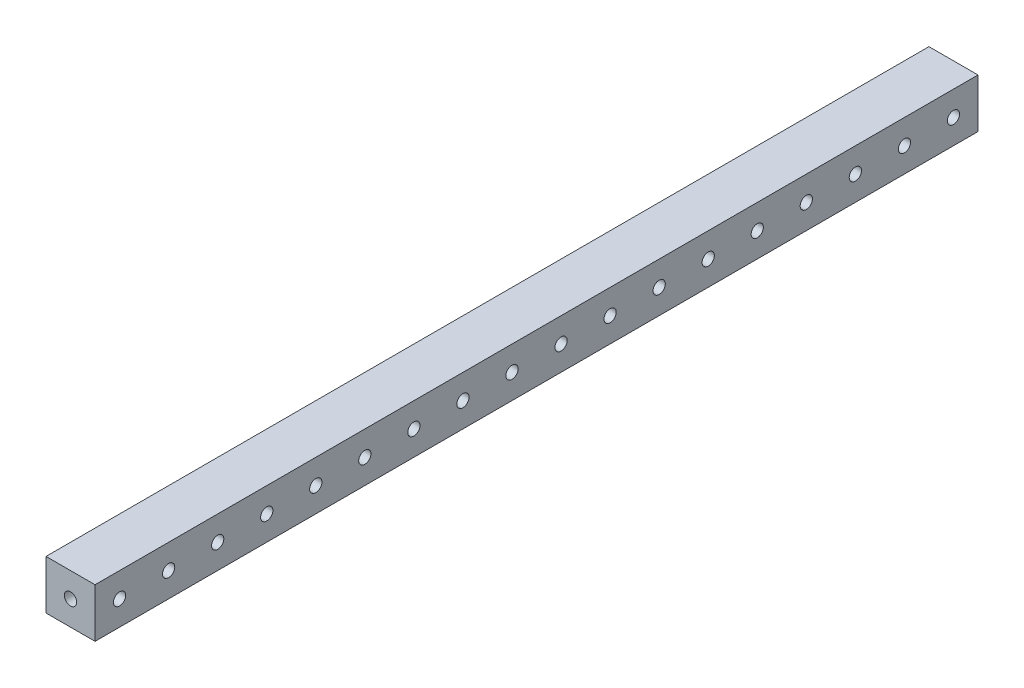
ISO-10303-21;
HEADER;
FILE_DESCRIPTION(('STEP AP214'),'2;1');
FILE_NAME('part.step','',(''),(''),'','','');
FILE_SCHEMA(('AUTOMOTIVE_DESIGN { 1 0 10303 214 1 1 1 1 }'));
ENDSEC;
DATA;
#1=APPLICATION_CONTEXT('core data for automotive mechanical design processes');
#2=APPLICATION_PROTOCOL_DEFINITION('international standard','automotive_design',2000,#1);
#3=PRODUCT_CONTEXT('',#1,'mechanical');
#4=PRODUCT('Part','Part','',(#3));
#5=PRODUCT_RELATED_PRODUCT_CATEGORY('part','',(#4));
#6=PRODUCT_DEFINITION_FORMATION('','',#4);
#7=PRODUCT_DEFINITION_CONTEXT('part definition',#1,'design');
#8=PRODUCT_DEFINITION('design','',#6,#7);
#9=PRODUCT_DEFINITION_SHAPE('','',#8);
#10=(LENGTH_UNIT() NAMED_UNIT(*) SI_UNIT(.MILLI.,.METRE.));
#11=(NAMED_UNIT(*) PLANE_ANGLE_UNIT() SI_UNIT($,.RADIAN.));
#12=(NAMED_UNIT(*) SI_UNIT($,.STERADIAN.) SOLID_ANGLE_UNIT());
#13=UNCERTAINTY_MEASURE_WITH_UNIT(LENGTH_MEASURE(1.E-05),#10,'distance_accuracy_value','');
#14=(GEOMETRIC_REPRESENTATION_CONTEXT(3) GLOBAL_UNCERTAINTY_ASSIGNED_CONTEXT((#13)) GLOBAL_UNIT_ASSIGNED_CONTEXT((#10,
#11,#12)) REPRESENTATION_CONTEXT('',''));
#15=CARTESIAN_POINT('',(0.,0.,0.));
#16=DIRECTION('',(0.,0.,1.));
#17=DIRECTION('',(1.,0.,0.));
#18=AXIS2_PLACEMENT_3D('',#15,#16,#17);
#19=CARTESIAN_POINT('',(10.,0.,-170.));
#20=DIRECTION('',(1.,0.,0.));
#21=DIRECTION('',(0.,0.,-1.));
#22=AXIS2_PLACEMENT_3D('',#19,#20,#21);
#23=CYLINDRICAL_SURFACE('',#22,2.5);
#24=CARTESIAN_POINT('',(10.,0.,-170.));
#25=DIRECTION('',(1.,0.,0.));
#26=DIRECTION('',(0.,0.,-1.));
#27=AXIS2_PLACEMENT_3D('',#24,#25,#26);
#28=CIRCLE('',#27,2.5);
#29=CARTESIAN_POINT('',(10.,0.,-172.5));
#30=VERTEX_POINT('',#29);
#31=EDGE_CURVE('E117',#30,#30,#28,.T.);
#32=ORIENTED_EDGE('',*,*,#31,.T.);
#33=EDGE_LOOP('',(#32));
#34=FACE_BOUND('',#33,.T.);
#35=CARTESIAN_POINT('',(0.,0.,-170.));
#36=DIRECTION('',(0.707106781186547,0.,0.707106781186547));
#37=DIRECTION('',(0.707106781186547,0.,-0.707106781186547));
#38=AXIS2_PLACEMENT_3D('',#35,#36,#37);
#39=ELLIPSE('',#38,3.53553390593271,2.49999999999998);
#40=CARTESIAN_POINT('',(0.,2.49999999999998,-170.));
#41=VERTEX_POINT('',#40);
#42=CARTESIAN_POINT('',(0.,-2.49999999999998,-170.));
#43=VERTEX_POINT('',#42);
#44=EDGE_CURVE('E46',#41,#43,#39,.F.);
#45=ORIENTED_EDGE('',*,*,#44,.T.);
#46=CARTESIAN_POINT('',(0.,0.,-170.));
#47=DIRECTION('',(0.707106781186547,0.,-0.707106781186547));
#48=DIRECTION('',(0.707106781186547,0.,0.707106781186547));
#49=AXIS2_PLACEMENT_3D('',#46,#47,#48);
#50=ELLIPSE('',#49,3.53553390593271,2.49999999999998);
#51=EDGE_CURVE('E11',#43,#41,#50,.F.);
#52=ORIENTED_EDGE('',*,*,#51,.T.);
#53=EDGE_LOOP('',(#45,#52));
#54=FACE_BOUND('',#53,.T.);
#55=ADVANCED_FACE('F33',(#34,#54),#23,.F.);
#56=CARTESIAN_POINT('',(10.,0.,170.));
#57=DIRECTION('',(1.,0.,0.));
#58=DIRECTION('',(0.,0.,-1.));
#59=AXIS2_PLACEMENT_3D('',#56,#57,#58);
#60=CYLINDRICAL_SURFACE('',#59,2.5);
#61=CARTESIAN_POINT('',(10.,0.,170.));
#62=DIRECTION('',(1.,0.,0.));
#63=DIRECTION('',(0.,0.,-1.));
#64=AXIS2_PLACEMENT_3D('',#61,#62,#63);
#65=CIRCLE('',#64,2.5);
#66=CARTESIAN_POINT('',(10.,0.,167.5));
#67=VERTEX_POINT('',#66);
#68=EDGE_CURVE('E246',#67,#67,#65,.T.);
#69=ORIENTED_EDGE('',*,*,#68,.T.);
#70=EDGE_LOOP('',(#69));
#71=FACE_BOUND('',#70,.T.);
#72=CARTESIAN_POINT('',(0.,0.,170.));
#73=DIRECTION('',(0.707106781186547,0.,-0.707106781186547));
#74=DIRECTION('',(0.707106781186547,0.,0.707106781186547));
#75=AXIS2_PLACEMENT_3D('',#72,#73,#74);
#76=ELLIPSE('',#75,3.53553390593271,2.49999999999998);
#77=CARTESIAN_POINT('',(0.,-2.49999999999998,170.));
#78=VERTEX_POINT('',#77);
#79=CARTESIAN_POINT('',(0.,2.49999999999998,170.));
#80=VERTEX_POINT('',#79);
#81=EDGE_CURVE('E53',#78,#80,#76,.F.);
#82=ORIENTED_EDGE('',*,*,#81,.T.);
#83=CARTESIAN_POINT('',(0.,0.,170.));
#84=DIRECTION('',(0.707106781186547,0.,0.707106781186547));
#85=DIRECTION('',(0.707106781186547,0.,-0.707106781186547));
#86=AXIS2_PLACEMENT_3D('',#83,#84,#85);
#87=ELLIPSE('',#86,3.53553390593271,2.49999999999998);
#88=EDGE_CURVE('E256',#80,#78,#87,.F.);
#89=ORIENTED_EDGE('',*,*,#88,.T.);
#90=EDGE_LOOP('',(#82,#89));
#91=FACE_BOUND('',#90,.T.);
#92=ADVANCED_FACE('F270',(#71,#91),#60,.F.);
#93=CARTESIAN_POINT('',(0.,0.,170.));
#94=DIRECTION('',(0.707106781186547,0.,-0.707106781186547));
#95=DIRECTION('',(0.707106781186547,0.,0.707106781186547));
#96=AXIS2_PLACEMENT_3D('',#93,#94,#95);
#97=ELLIPSE('',#96,3.53553390593271,2.49999999999998);
#98=EDGE_CURVE('E250',#78,#80,#97,.T.);
#99=ORIENTED_EDGE('',*,*,#98,.T.);
#100=CARTESIAN_POINT('',(0.,0.,170.));
#101=DIRECTION('',(0.707106781186547,0.,0.707106781186547));
#102=DIRECTION('',(0.707106781186547,0.,-0.707106781186547));
#103=AXIS2_PLACEMENT_3D('',#100,#101,#102);
#104=ELLIPSE('',#103,3.53553390593271,2.49999999999998);
#105=EDGE_CURVE('E253',#80,#78,#104,.T.);
#106=ORIENTED_EDGE('',*,*,#105,.T.);
#107=EDGE_LOOP('',(#99,#106));
#108=FACE_BOUND('',#107,.T.);
#109=CARTESIAN_POINT('',(-10.,0.,170.));
#110=DIRECTION('',(1.,0.,0.));
#111=DIRECTION('',(0.,0.,-1.));
#112=AXIS2_PLACEMENT_3D('',#109,#110,#111);
#113=CIRCLE('',#112,2.5);
#114=CARTESIAN_POINT('',(-10.,0.,167.5));
#115=VERTEX_POINT('',#114);
#116=EDGE_CURVE('E243',#115,#115,#113,.T.);
#117=ORIENTED_EDGE('',*,*,#116,.F.);
#118=EDGE_LOOP('',(#117));
#119=FACE_BOUND('',#118,.T.);
#120=ADVANCED_FACE('F35',(#108,#119),#60,.F.);
#121=CARTESIAN_POINT('',(10.,0.,150.));
#122=DIRECTION('',(1.,0.,0.));
#123=DIRECTION('',(0.,0.,-1.));
#124=AXIS2_PLACEMENT_3D('',#121,#122,#123);
#125=CYLINDRICAL_SURFACE('',#124,2.5);
#126=CARTESIAN_POINT('',(-10.,0.,150.));
#127=DIRECTION('',(1.,0.,0.));
#128=DIRECTION('',(0.,0.,-1.));
#129=AXIS2_PLACEMENT_3D('',#126,#127,#128);
#130=CIRCLE('',#129,2.5);
#131=CARTESIAN_POINT('',(-10.,0.,147.5));
#132=VERTEX_POINT('',#131);
#133=EDGE_CURVE('E237',#132,#132,#130,.T.);
#134=ORIENTED_EDGE('',*,*,#133,.F.);
#135=EDGE_LOOP('',(#134));
#136=FACE_BOUND('',#135,.T.);
#137=CARTESIAN_POINT('',(10.,0.,150.));
#138=DIRECTION('',(1.,0.,0.));
#139=DIRECTION('',(0.,0.,-1.));
#140=AXIS2_PLACEMENT_3D('',#137,#138,#139);
#141=CIRCLE('',#140,2.5);
#142=CARTESIAN_POINT('',(10.,0.,147.5));
#143=VERTEX_POINT('',#142);
#144=EDGE_CURVE('E240',#143,#143,#141,.T.);
#145=ORIENTED_EDGE('',*,*,#144,.T.);
#146=EDGE_LOOP('',(#145));
#147=FACE_BOUND('',#146,.T.);
#148=ADVANCED_FACE('F368',(#136,#147),#125,.F.);
#149=CARTESIAN_POINT('',(10.,0.,130.));
#150=DIRECTION('',(1.,0.,0.));
#151=DIRECTION('',(0.,0.,-1.));
#152=AXIS2_PLACEMENT_3D('',#149,#150,#151);
#153=CYLINDRICAL_SURFACE('',#152,2.5);
#154=CARTESIAN_POINT('',(-10.,0.,130.));
#155=DIRECTION('',(1.,0.,0.));
#156=DIRECTION('',(0.,0.,-1.));
#157=AXIS2_PLACEMENT_3D('',#154,#155,#156);
#158=CIRCLE('',#157,2.5);
#159=CARTESIAN_POINT('',(-10.,0.,127.5));
#160=VERTEX_POINT('',#159);
#161=EDGE_CURVE('E231',#160,#160,#158,.T.);
#162=ORIENTED_EDGE('',*,*,#161,.F.);
#163=EDGE_LOOP('',(#162));
#164=FACE_BOUND('',#163,.T.);
#165=CARTESIAN_POINT('',(10.,0.,130.));
#166=DIRECTION('',(1.,0.,0.));
#167=DIRECTION('',(0.,0.,-1.));
#168=AXIS2_PLACEMENT_3D('',#165,#166,#167);
#169=CIRCLE('',#168,2.5);
#170=CARTESIAN_POINT('',(10.,0.,127.5));
#171=VERTEX_POINT('',#170);
#172=EDGE_CURVE('E234',#171,#171,#169,.T.);
#173=ORIENTED_EDGE('',*,*,#172,.T.);
#174=EDGE_LOOP('',(#173));
#175=FACE_BOUND('',#174,.T.);
#176=ADVANCED_FACE('F365',(#164,#175),#153,.F.);
#177=CARTESIAN_POINT('',(10.,0.,110.));
#178=DIRECTION('',(1.,0.,0.));
#179=DIRECTION('',(0.,0.,-1.));
#180=AXIS2_PLACEMENT_3D('',#177,#178,#179);
#181=CYLINDRICAL_SURFACE('',#180,2.5);
#182=CARTESIAN_POINT('',(-10.,0.,110.));
#183=DIRECTION('',(1.,0.,0.));
#184=DIRECTION('',(0.,0.,-1.));
#185=AXIS2_PLACEMENT_3D('',#182,#183,#184);
#186=CIRCLE('',#185,2.5);
#187=CARTESIAN_POINT('',(-10.,0.,107.5));
#188=VERTEX_POINT('',#187);
#189=EDGE_CURVE('E225',#188,#188,#186,.T.);
#190=ORIENTED_EDGE('',*,*,#189,.F.);
#191=EDGE_LOOP('',(#190));
#192=FACE_BOUND('',#191,.T.);
#193=CARTESIAN_POINT('',(10.,0.,110.));
#194=DIRECTION('',(1.,0.,0.));
#195=DIRECTION('',(0.,0.,-1.));
#196=AXIS2_PLACEMENT_3D('',#193,#194,#195);
#197=CIRCLE('',#196,2.5);
#198=CARTESIAN_POINT('',(10.,0.,107.5));
#199=VERTEX_POINT('',#198);
#200=EDGE_CURVE('E228',#199,#199,#197,.T.);
#201=ORIENTED_EDGE('',*,*,#200,.T.);
#202=EDGE_LOOP('',(#201));
#203=FACE_BOUND('',#202,.T.);
#204=ADVANCED_FACE('F361',(#192,#203),#181,.F.);
#205=CARTESIAN_POINT('',(10.,0.,90.));
#206=DIRECTION('',(1.,0.,0.));
#207=DIRECTION('',(0.,0.,-1.));
#208=AXIS2_PLACEMENT_3D('',#205,#206,#207);
#209=CYLINDRICAL_SURFACE('',#208,2.5);
#210=CARTESIAN_POINT('',(-10.,0.,90.));
#211=DIRECTION('',(1.,0.,0.));
#212=DIRECTION('',(0.,0.,-1.));
#213=AXIS2_PLACEMENT_3D('',#210,#211,#212);
#214=CIRCLE('',#213,2.5);
#215=CARTESIAN_POINT('',(-10.,0.,87.5));
#216=VERTEX_POINT('',#215);
#217=EDGE_CURVE('E219',#216,#216,#214,.T.);
#218=ORIENTED_EDGE('',*,*,#217,.F.);
#219=EDGE_LOOP('',(#218));
#220=FACE_BOUND('',#219,.T.);
#221=CARTESIAN_POINT('',(10.,0.,90.));
#222=DIRECTION('',(1.,0.,0.));
#223=DIRECTION('',(0.,0.,-1.));
#224=AXIS2_PLACEMENT_3D('',#221,#222,#223);
#225=CIRCLE('',#224,2.5);
#226=CARTESIAN_POINT('',(10.,0.,87.5));
#227=VERTEX_POINT('',#226);
#228=EDGE_CURVE('E222',#227,#227,#225,.T.);
#229=ORIENTED_EDGE('',*,*,#228,.T.);
#230=EDGE_LOOP('',(#229));
#231=FACE_BOUND('',#230,.T.);
#232=ADVANCED_FACE('F357',(#220,#231),#209,.F.);
#233=CARTESIAN_POINT('',(10.,0.,70.));
#234=DIRECTION('',(1.,0.,0.));
#235=DIRECTION('',(0.,0.,-1.));
#236=AXIS2_PLACEMENT_3D('',#233,#234,#235);
#237=CYLINDRICAL_SURFACE('',#236,2.5);
#238=CARTESIAN_POINT('',(-10.,0.,70.));
#239=DIRECTION('',(1.,0.,0.));
#240=DIRECTION('',(0.,0.,-1.));
#241=AXIS2_PLACEMENT_3D('',#238,#239,#240);
#242=CIRCLE('',#241,2.5);
#243=CARTESIAN_POINT('',(-10.,0.,67.5));
#244=VERTEX_POINT('',#243);
#245=EDGE_CURVE('E213',#244,#244,#242,.T.);
#246=ORIENTED_EDGE('',*,*,#245,.F.);
#247=EDGE_LOOP('',(#246));
#248=FACE_BOUND('',#247,.T.);
#249=CARTESIAN_POINT('',(10.,0.,70.));
#250=DIRECTION('',(1.,0.,0.));
#251=DIRECTION('',(0.,0.,-1.));
#252=AXIS2_PLACEMENT_3D('',#249,#250,#251);
#253=CIRCLE('',#252,2.5);
#254=CARTESIAN_POINT('',(10.,0.,67.5));
#255=VERTEX_POINT('',#254);
#256=EDGE_CURVE('E216',#255,#255,#253,.T.);
#257=ORIENTED_EDGE('',*,*,#256,.T.);
#258=EDGE_LOOP('',(#257));
#259=FACE_BOUND('',#258,.T.);
#260=ADVANCED_FACE('F353',(#248,#259),#237,.F.);
#261=CARTESIAN_POINT('',(10.,0.,50.));
#262=DIRECTION('',(1.,0.,0.));
#263=DIRECTION('',(0.,0.,-1.));
#264=AXIS2_PLACEMENT_3D('',#261,#262,#263);
#265=CYLINDRICAL_SURFACE('',#264,2.5);
#266=CARTESIAN_POINT('',(-10.,0.,50.));
#267=DIRECTION('',(1.,0.,0.));
#268=DIRECTION('',(0.,0.,-1.));
#269=AXIS2_PLACEMENT_3D('',#266,#267,#268);
#270=CIRCLE('',#269,2.5);
#271=CARTESIAN_POINT('',(-10.,0.,47.5));
#272=VERTEX_POINT('',#271);
#273=EDGE_CURVE('E207',#272,#272,#270,.T.);
#274=ORIENTED_EDGE('',*,*,#273,.F.);
#275=EDGE_LOOP('',(#274));
#276=FACE_BOUND('',#275,.T.);
#277=CARTESIAN_POINT('',(10.,0.,50.));
#278=DIRECTION('',(1.,0.,0.));
#279=DIRECTION('',(0.,0.,-1.));
#280=AXIS2_PLACEMENT_3D('',#277,#278,#279);
#281=CIRCLE('',#280,2.5);
#282=CARTESIAN_POINT('',(10.,0.,47.5));
#283=VERTEX_POINT('',#282);
#284=EDGE_CURVE('E210',#283,#283,#281,.T.);
#285=ORIENTED_EDGE('',*,*,#284,.T.);
#286=EDGE_LOOP('',(#285));
#287=FACE_BOUND('',#286,.T.);
#288=ADVANCED_FACE('F349',(#276,#287),#265,.F.);
#289=CARTESIAN_POINT('',(10.,0.,30.));
#290=DIRECTION('',(1.,0.,0.));
#291=DIRECTION('',(0.,0.,-1.));
#292=AXIS2_PLACEMENT_3D('',#289,#290,#291);
#293=CYLINDRICAL_SURFACE('',#292,2.5);
#294=CARTESIAN_POINT('',(-10.,0.,30.));
#295=DIRECTION('',(1.,0.,0.));
#296=DIRECTION('',(0.,0.,-1.));
#297=AXIS2_PLACEMENT_3D('',#294,#295,#296);
#298=CIRCLE('',#297,2.5);
#299=CARTESIAN_POINT('',(-10.,0.,27.5));
#300=VERTEX_POINT('',#299);
#301=EDGE_CURVE('E201',#300,#300,#298,.T.);
#302=ORIENTED_EDGE('',*,*,#301,.F.);
#303=EDGE_LOOP('',(#302));
#304=FACE_BOUND('',#303,.T.);
#305=CARTESIAN_POINT('',(10.,0.,30.));
#306=DIRECTION('',(1.,0.,0.));
#307=DIRECTION('',(0.,0.,-1.));
#308=AXIS2_PLACEMENT_3D('',#305,#306,#307);
#309=CIRCLE('',#308,2.5);
#310=CARTESIAN_POINT('',(10.,0.,27.5));
#311=VERTEX_POINT('',#310);
#312=EDGE_CURVE('E204',#311,#311,#309,.T.);
#313=ORIENTED_EDGE('',*,*,#312,.T.);
#314=EDGE_LOOP('',(#313));
#315=FACE_BOUND('',#314,.T.);
#316=ADVANCED_FACE('F345',(#304,#315),#293,.F.);
#317=CARTESIAN_POINT('',(10.,0.,9.99999999999998));
#318=DIRECTION('',(1.,0.,0.));
#319=DIRECTION('',(0.,0.,-1.));
#320=AXIS2_PLACEMENT_3D('',#317,#318,#319);
#321=CYLINDRICAL_SURFACE('',#320,2.5);
#322=CARTESIAN_POINT('',(-10.,0.,9.99999999999998));
#323=DIRECTION('',(1.,0.,0.));
#324=DIRECTION('',(0.,0.,-1.));
#325=AXIS2_PLACEMENT_3D('',#322,#323,#324);
#326=CIRCLE('',#325,2.5);
#327=CARTESIAN_POINT('',(-10.,0.,7.49999999999999));
#328=VERTEX_POINT('',#327);
#329=EDGE_CURVE('E195',#328,#328,#326,.T.);
#330=ORIENTED_EDGE('',*,*,#329,.F.);
#331=EDGE_LOOP('',(#330));
#332=FACE_BOUND('',#331,.T.);
#333=CARTESIAN_POINT('',(10.,0.,9.99999999999998));
#334=DIRECTION('',(1.,0.,0.));
#335=DIRECTION('',(0.,0.,-1.));
#336=AXIS2_PLACEMENT_3D('',#333,#334,#335);
#337=CIRCLE('',#336,2.5);
#338=CARTESIAN_POINT('',(10.,0.,7.49999999999998));
#339=VERTEX_POINT('',#338);
#340=EDGE_CURVE('E198',#339,#339,#337,.T.);
#341=ORIENTED_EDGE('',*,*,#340,.T.);
#342=EDGE_LOOP('',(#341));
#343=FACE_BOUND('',#342,.T.);
#344=ADVANCED_FACE('F341',(#332,#343),#321,.F.);
#345=CARTESIAN_POINT('',(10.,0.,-10.));
#346=DIRECTION('',(1.,0.,0.));
#347=DIRECTION('',(0.,0.,-1.));
#348=AXIS2_PLACEMENT_3D('',#345,#346,#347);
#349=CYLINDRICAL_SURFACE('',#348,2.5);
#350=CARTESIAN_POINT('',(-10.,0.,-10.));
#351=DIRECTION('',(1.,0.,0.));
#352=DIRECTION('',(0.,0.,-1.));
#353=AXIS2_PLACEMENT_3D('',#350,#351,#352);
#354=CIRCLE('',#353,2.5);
#355=CARTESIAN_POINT('',(-10.,0.,-12.5));
#356=VERTEX_POINT('',#355);
#357=EDGE_CURVE('E189',#356,#356,#354,.T.);
#358=ORIENTED_EDGE('',*,*,#357,.F.);
#359=EDGE_LOOP('',(#358));
#360=FACE_BOUND('',#359,.T.);
#361=CARTESIAN_POINT('',(10.,0.,-10.));
#362=DIRECTION('',(1.,0.,0.));
#363=DIRECTION('',(0.,0.,-1.));
#364=AXIS2_PLACEMENT_3D('',#361,#362,#363);
#365=CIRCLE('',#364,2.5);
#366=CARTESIAN_POINT('',(10.,0.,-12.5));
#367=VERTEX_POINT('',#366);
#368=EDGE_CURVE('E192',#367,#367,#365,.T.);
#369=ORIENTED_EDGE('',*,*,#368,.T.);
#370=EDGE_LOOP('',(#369));
#371=FACE_BOUND('',#370,.T.);
#372=ADVANCED_FACE('F337',(#360,#371),#349,.F.);
#373=CARTESIAN_POINT('',(10.,0.,-30.));
#374=DIRECTION('',(1.,0.,0.));
#375=DIRECTION('',(0.,0.,-1.));
#376=AXIS2_PLACEMENT_3D('',#373,#374,#375);
#377=CYLINDRICAL_SURFACE('',#376,2.5);
#378=CARTESIAN_POINT('',(-10.,0.,-30.));
#379=DIRECTION('',(1.,0.,0.));
#380=DIRECTION('',(0.,0.,-1.));
#381=AXIS2_PLACEMENT_3D('',#378,#379,#380);
#382=CIRCLE('',#381,2.5);
#383=CARTESIAN_POINT('',(-10.,0.,-32.5));
#384=VERTEX_POINT('',#383);
#385=EDGE_CURVE('E183',#384,#384,#382,.T.);
#386=ORIENTED_EDGE('',*,*,#385,.F.);
#387=EDGE_LOOP('',(#386));
#388=FACE_BOUND('',#387,.T.);
#389=CARTESIAN_POINT('',(10.,0.,-30.));
#390=DIRECTION('',(1.,0.,0.));
#391=DIRECTION('',(0.,0.,-1.));
#392=AXIS2_PLACEMENT_3D('',#389,#390,#391);
#393=CIRCLE('',#392,2.5);
#394=CARTESIAN_POINT('',(10.,0.,-32.5));
#395=VERTEX_POINT('',#394);
#396=EDGE_CURVE('E186',#395,#395,#393,.T.);
#397=ORIENTED_EDGE('',*,*,#396,.T.);
#398=EDGE_LOOP('',(#397));
#399=FACE_BOUND('',#398,.T.);
#400=ADVANCED_FACE('F333',(#388,#399),#377,.F.);
#401=CARTESIAN_POINT('',(10.,0.,-50.));
#402=DIRECTION('',(1.,0.,0.));
#403=DIRECTION('',(0.,0.,-1.));
#404=AXIS2_PLACEMENT_3D('',#401,#402,#403);
#405=CYLINDRICAL_SURFACE('',#404,2.5);
#406=CARTESIAN_POINT('',(-10.,0.,-50.));
#407=DIRECTION('',(1.,0.,0.));
#408=DIRECTION('',(0.,0.,-1.));
#409=AXIS2_PLACEMENT_3D('',#406,#407,#408);
#410=CIRCLE('',#409,2.5);
#411=CARTESIAN_POINT('',(-10.,0.,-52.5));
#412=VERTEX_POINT('',#411);
#413=EDGE_CURVE('E177',#412,#412,#410,.T.);
#414=ORIENTED_EDGE('',*,*,#413,.F.);
#415=EDGE_LOOP('',(#414));
#416=FACE_BOUND('',#415,.T.);
#417=CARTESIAN_POINT('',(10.,0.,-50.));
#418=DIRECTION('',(1.,0.,0.));
#419=DIRECTION('',(0.,0.,-1.));
#420=AXIS2_PLACEMENT_3D('',#417,#418,#419);
#421=CIRCLE('',#420,2.5);
#422=CARTESIAN_POINT('',(10.,0.,-52.5));
#423=VERTEX_POINT('',#422);
#424=EDGE_CURVE('E180',#423,#423,#421,.T.);
#425=ORIENTED_EDGE('',*,*,#424,.T.);
#426=EDGE_LOOP('',(#425));
#427=FACE_BOUND('',#426,.T.);
#428=ADVANCED_FACE('F329',(#416,#427),#405,.F.);
#429=CARTESIAN_POINT('',(10.,0.,-70.));
#430=DIRECTION('',(1.,0.,0.));
#431=DIRECTION('',(0.,0.,-1.));
#432=AXIS2_PLACEMENT_3D('',#429,#430,#431);
#433=CYLINDRICAL_SURFACE('',#432,2.5);
#434=CARTESIAN_POINT('',(-10.,0.,-70.));
#435=DIRECTION('',(1.,0.,0.));
#436=DIRECTION('',(0.,0.,-1.));
#437=AXIS2_PLACEMENT_3D('',#434,#435,#436);
#438=CIRCLE('',#437,2.5);
#439=CARTESIAN_POINT('',(-10.,0.,-72.5));
#440=VERTEX_POINT('',#439);
#441=EDGE_CURVE('E171',#440,#440,#438,.T.);
#442=ORIENTED_EDGE('',*,*,#441,.F.);
#443=EDGE_LOOP('',(#442));
#444=FACE_BOUND('',#443,.T.);
#445=CARTESIAN_POINT('',(10.,0.,-70.));
#446=DIRECTION('',(1.,0.,0.));
#447=DIRECTION('',(0.,0.,-1.));
#448=AXIS2_PLACEMENT_3D('',#445,#446,#447);
#449=CIRCLE('',#448,2.5);
#450=CARTESIAN_POINT('',(10.,0.,-72.5));
#451=VERTEX_POINT('',#450);
#452=EDGE_CURVE('E174',#451,#451,#449,.T.);
#453=ORIENTED_EDGE('',*,*,#452,.T.);
#454=EDGE_LOOP('',(#453));
#455=FACE_BOUND('',#454,.T.);
#456=ADVANCED_FACE('F325',(#444,#455),#433,.F.);
#457=CARTESIAN_POINT('',(10.,0.,-90.));
#458=DIRECTION('',(1.,0.,0.));
#459=DIRECTION('',(0.,0.,-1.));
#460=AXIS2_PLACEMENT_3D('',#457,#458,#459);
#461=CYLINDRICAL_SURFACE('',#460,2.5);
#462=CARTESIAN_POINT('',(-10.,0.,-90.));
#463=DIRECTION('',(1.,0.,0.));
#464=DIRECTION('',(0.,0.,-1.));
#465=AXIS2_PLACEMENT_3D('',#462,#463,#464);
#466=CIRCLE('',#465,2.5);
#467=CARTESIAN_POINT('',(-10.,0.,-92.5));
#468=VERTEX_POINT('',#467);
#469=EDGE_CURVE('E165',#468,#468,#466,.T.);
#470=ORIENTED_EDGE('',*,*,#469,.F.);
#471=EDGE_LOOP('',(#470));
#472=FACE_BOUND('',#471,.T.);
#473=CARTESIAN_POINT('',(10.,0.,-90.));
#474=DIRECTION('',(1.,0.,0.));
#475=DIRECTION('',(0.,0.,-1.));
#476=AXIS2_PLACEMENT_3D('',#473,#474,#475);
#477=CIRCLE('',#476,2.5);
#478=CARTESIAN_POINT('',(10.,0.,-92.5));
#479=VERTEX_POINT('',#478);
#480=EDGE_CURVE('E168',#479,#479,#477,.T.);
#481=ORIENTED_EDGE('',*,*,#480,.T.);
#482=EDGE_LOOP('',(#481));
#483=FACE_BOUND('',#482,.T.);
#484=ADVANCED_FACE('F321',(#472,#483),#461,.F.);
#485=CARTESIAN_POINT('',(10.,0.,-110.));
#486=DIRECTION('',(1.,0.,0.));
#487=DIRECTION('',(0.,0.,-1.));
#488=AXIS2_PLACEMENT_3D('',#485,#486,#487);
#489=CYLINDRICAL_SURFACE('',#488,2.5);
#490=CARTESIAN_POINT('',(-10.,0.,-110.));
#491=DIRECTION('',(1.,0.,0.));
#492=DIRECTION('',(0.,0.,-1.));
#493=AXIS2_PLACEMENT_3D('',#490,#491,#492);
#494=CIRCLE('',#493,2.5);
#495=CARTESIAN_POINT('',(-10.,0.,-112.5));
#496=VERTEX_POINT('',#495);
#497=EDGE_CURVE('E159',#496,#496,#494,.T.);
#498=ORIENTED_EDGE('',*,*,#497,.F.);
#499=EDGE_LOOP('',(#498));
#500=FACE_BOUND('',#499,.T.);
#501=CARTESIAN_POINT('',(10.,0.,-110.));
#502=DIRECTION('',(1.,0.,0.));
#503=DIRECTION('',(0.,0.,-1.));
#504=AXIS2_PLACEMENT_3D('',#501,#502,#503);
#505=CIRCLE('',#504,2.5);
#506=CARTESIAN_POINT('',(10.,0.,-112.5));
#507=VERTEX_POINT('',#506);
#508=EDGE_CURVE('E162',#507,#507,#505,.T.);
#509=ORIENTED_EDGE('',*,*,#508,.T.);
#510=EDGE_LOOP('',(#509));
#511=FACE_BOUND('',#510,.T.);
#512=ADVANCED_FACE('F317',(#500,#511),#489,.F.);
#513=CARTESIAN_POINT('',(10.,0.,-130.));
#514=DIRECTION('',(1.,0.,0.));
#515=DIRECTION('',(0.,0.,-1.));
#516=AXIS2_PLACEMENT_3D('',#513,#514,#515);
#517=CYLINDRICAL_SURFACE('',#516,2.5);
#518=CARTESIAN_POINT('',(-10.,0.,-130.));
#519=DIRECTION('',(1.,0.,0.));
#520=DIRECTION('',(0.,0.,-1.));
#521=AXIS2_PLACEMENT_3D('',#518,#519,#520);
#522=CIRCLE('',#521,2.5);
#523=CARTESIAN_POINT('',(-10.,0.,-132.5));
#524=VERTEX_POINT('',#523);
#525=EDGE_CURVE('E153',#524,#524,#522,.T.);
#526=ORIENTED_EDGE('',*,*,#525,.F.);
#527=EDGE_LOOP('',(#526));
#528=FACE_BOUND('',#527,.T.);
#529=CARTESIAN_POINT('',(10.,0.,-130.));
#530=DIRECTION('',(1.,0.,0.));
#531=DIRECTION('',(0.,0.,-1.));
#532=AXIS2_PLACEMENT_3D('',#529,#530,#531);
#533=CIRCLE('',#532,2.5);
#534=CARTESIAN_POINT('',(10.,0.,-132.5));
#535=VERTEX_POINT('',#534);
#536=EDGE_CURVE('E156',#535,#535,#533,.T.);
#537=ORIENTED_EDGE('',*,*,#536,.T.);
#538=EDGE_LOOP('',(#537));
#539=FACE_BOUND('',#538,.T.);
#540=ADVANCED_FACE('F313',(#528,#539),#517,.F.);
#541=CARTESIAN_POINT('',(-10.,10.0000000000001,180.));
#542=DIRECTION('',(1.,0.,0.));
#543=DIRECTION('',(0.,1.,0.));
#544=AXIS2_PLACEMENT_3D('',#541,#542,#543);
#545=PLANE('',#544);
#546=CARTESIAN_POINT('',(-10.,0.,-150.));
#547=DIRECTION('',(1.,0.,0.));
#548=DIRECTION('',(0.,0.,-1.));
#549=AXIS2_PLACEMENT_3D('',#546,#547,#548);
#550=CIRCLE('',#549,2.5);
#551=CARTESIAN_POINT('',(-10.,0.,-152.5));
#552=VERTEX_POINT('',#551);
#553=EDGE_CURVE('E111',#552,#552,#550,.T.);
#554=ORIENTED_EDGE('',*,*,#553,.T.);
#555=EDGE_LOOP('',(#554));
#556=FACE_BOUND('',#555,.T.);
#557=CARTESIAN_POINT('',(-10.,0.,-170.));
#558=DIRECTION('',(1.,0.,0.));
#559=DIRECTION('',(0.,0.,-1.));
#560=AXIS2_PLACEMENT_3D('',#557,#558,#559);
#561=CIRCLE('',#560,2.5);
#562=CARTESIAN_POINT('',(-10.,0.,-172.5));
#563=VERTEX_POINT('',#562);
#564=EDGE_CURVE('E120',#563,#563,#561,.T.);
#565=ORIENTED_EDGE('',*,*,#564,.T.);
#566=EDGE_LOOP('',(#565));
#567=FACE_BOUND('',#566,.T.);
#568=DIRECTION('',(0.,-1.,0.));
#569=VECTOR('',#568,1.);
#570=CARTESIAN_POINT('',(-10.,10.0000000000001,-180.));
#571=LINE('',#570,#569);
#572=CARTESIAN_POINT('',(-10.,10.0000000000001,-180.));
#573=VERTEX_POINT('',#572);
#574=CARTESIAN_POINT('',(-10.,-10.0000000000001,-180.));
#575=VERTEX_POINT('',#574);
#576=EDGE_CURVE('E123',#573,#575,#571,.T.);
#577=ORIENTED_EDGE('',*,*,#576,.T.);
#578=DIRECTION('',(0.,0.,-1.));
#579=VECTOR('',#578,1.);
#580=CARTESIAN_POINT('',(-10.,-10.0000000000001,180.));
#581=LINE('',#580,#579);
#582=CARTESIAN_POINT('',(-10.,-10.0000000000001,180.));
#583=VERTEX_POINT('',#582);
#584=EDGE_CURVE('E150',#583,#575,#581,.T.);
#585=ORIENTED_EDGE('',*,*,#584,.F.);
#586=DIRECTION('',(0.,-1.,0.));
#587=VECTOR('',#586,1.);
#588=CARTESIAN_POINT('',(-10.,10.0000000000001,180.));
#589=LINE('',#588,#587);
#590=CARTESIAN_POINT('',(-10.,10.0000000000001,180.));
#591=VERTEX_POINT('',#590);
#592=EDGE_CURVE('E124',#591,#583,#589,.T.);
#593=ORIENTED_EDGE('',*,*,#592,.F.);
#594=DIRECTION('',(0.,0.,-1.));
#595=VECTOR('',#594,1.);
#596=CARTESIAN_POINT('',(-10.,10.0000000000001,180.));
#597=LINE('',#596,#595);
#598=EDGE_CURVE('E134',#591,#573,#597,.T.);
#599=ORIENTED_EDGE('',*,*,#598,.T.);
#600=EDGE_LOOP('',(#577,#585,#593,#599));
#601=FACE_BOUND('',#600,.T.);
#602=ORIENTED_EDGE('',*,*,#525,.T.);
#603=EDGE_LOOP('',(#602));
#604=FACE_BOUND('',#603,.T.);
#605=ORIENTED_EDGE('',*,*,#497,.T.);
#606=EDGE_LOOP('',(#605));
#607=FACE_BOUND('',#606,.T.);
#608=ORIENTED_EDGE('',*,*,#469,.T.);
#609=EDGE_LOOP('',(#608));
#610=FACE_BOUND('',#609,.T.);
#611=ORIENTED_EDGE('',*,*,#441,.T.);
#612=EDGE_LOOP('',(#611));
#613=FACE_BOUND('',#612,.T.);
#614=ORIENTED_EDGE('',*,*,#413,.T.);
#615=EDGE_LOOP('',(#614));
#616=FACE_BOUND('',#615,.T.);
#617=ORIENTED_EDGE('',*,*,#385,.T.);
#618=EDGE_LOOP('',(#617));
#619=FACE_BOUND('',#618,.T.);
#620=ORIENTED_EDGE('',*,*,#357,.T.);
#621=EDGE_LOOP('',(#620));
#622=FACE_BOUND('',#621,.T.);
#623=ORIENTED_EDGE('',*,*,#329,.T.);
#624=EDGE_LOOP('',(#623));
#625=FACE_BOUND('',#624,.T.);
#626=ORIENTED_EDGE('',*,*,#301,.T.);
#627=EDGE_LOOP('',(#626));
#628=FACE_BOUND('',#627,.T.);
#629=ORIENTED_EDGE('',*,*,#273,.T.);
#630=EDGE_LOOP('',(#629));
#631=FACE_BOUND('',#630,.T.);
#632=ORIENTED_EDGE('',*,*,#245,.T.);
#633=EDGE_LOOP('',(#632));
#634=FACE_BOUND('',#633,.T.);
#635=ORIENTED_EDGE('',*,*,#217,.T.);
#636=EDGE_LOOP('',(#635));
#637=FACE_BOUND('',#636,.T.);
#638=ORIENTED_EDGE('',*,*,#189,.T.);
#639=EDGE_LOOP('',(#638));
#640=FACE_BOUND('',#639,.T.);
#641=ORIENTED_EDGE('',*,*,#161,.T.);
#642=EDGE_LOOP('',(#641));
#643=FACE_BOUND('',#642,.T.);
#644=ORIENTED_EDGE('',*,*,#133,.T.);
#645=EDGE_LOOP('',(#644));
#646=FACE_BOUND('',#645,.T.);
#647=ORIENTED_EDGE('',*,*,#116,.T.);
#648=EDGE_LOOP('',(#647));
#649=FACE_BOUND('',#648,.T.);
#650=ADVANCED_FACE('F309',(#556,#567,#601,#604,#607,#610,#613,#616,#619,#622,#625,#628,#631,
#634,#637,#640,#643,#646,#649),#545,.F.);
#651=CARTESIAN_POINT('',(-10.,-10.0000000000001,180.));
#652=DIRECTION('',(0.,1.,0.));
#653=DIRECTION('',(0.,0.,1.));
#654=AXIS2_PLACEMENT_3D('',#651,#652,#653);
#655=PLANE('',#654);
#656=DIRECTION('',(1.,0.,0.));
#657=VECTOR('',#656,1.);
#658=CARTESIAN_POINT('',(-10.,-10.0000000000001,-180.));
#659=LINE('',#658,#657);
#660=CARTESIAN_POINT('',(10.,-10.0000000000001,-180.));
#661=VERTEX_POINT('',#660);
#662=EDGE_CURVE('E137',#575,#661,#659,.T.);
#663=ORIENTED_EDGE('',*,*,#662,.T.);
#664=DIRECTION('',(0.,0.,-1.));
#665=VECTOR('',#664,1.);
#666=CARTESIAN_POINT('',(10.,-10.0000000000001,180.));
#667=LINE('',#666,#665);
#668=CARTESIAN_POINT('',(10.,-10.0000000000001,180.));
#669=VERTEX_POINT('',#668);
#670=EDGE_CURVE('E147',#669,#661,#667,.T.);
#671=ORIENTED_EDGE('',*,*,#670,.F.);
#672=DIRECTION('',(1.,0.,0.));
#673=VECTOR('',#672,1.);
#674=CARTESIAN_POINT('',(-10.,-10.0000000000001,180.));
#675=LINE('',#674,#673);
#676=EDGE_CURVE('E127',#583,#669,#675,.T.);
#677=ORIENTED_EDGE('',*,*,#676,.F.);
#678=ORIENTED_EDGE('',*,*,#584,.T.);
#679=EDGE_LOOP('',(#663,#671,#677,#678));
#680=FACE_BOUND('',#679,.T.);
#681=ADVANCED_FACE('F305',(#680),#655,.F.);
#682=CARTESIAN_POINT('',(10.,10.0000000000001,180.));
#683=DIRECTION('',(-1.,0.,0.));
#684=DIRECTION('',(0.,-1.,0.));
#685=AXIS2_PLACEMENT_3D('',#682,#683,#684);
#686=PLANE('',#685);
#687=CARTESIAN_POINT('',(10.,0.,-150.));
#688=DIRECTION('',(1.,0.,0.));
#689=DIRECTION('',(0.,0.,-1.));
#690=AXIS2_PLACEMENT_3D('',#687,#688,#689);
#691=CIRCLE('',#690,2.5);
#692=CARTESIAN_POINT('',(10.,0.,-152.5));
#693=VERTEX_POINT('',#692);
#694=EDGE_CURVE('E114',#693,#693,#691,.T.);
#695=ORIENTED_EDGE('',*,*,#694,.F.);
#696=EDGE_LOOP('',(#695));
#697=FACE_BOUND('',#696,.T.);
#698=ORIENTED_EDGE('',*,*,#31,.F.);
#699=EDGE_LOOP('',(#698));
#700=FACE_BOUND('',#699,.T.);
#701=DIRECTION('',(0.,1.,0.));
#702=VECTOR('',#701,1.);
#703=CARTESIAN_POINT('',(10.,10.0000000000001,-180.));
#704=LINE('',#703,#702);
#705=CARTESIAN_POINT('',(10.,10.0000000000001,-180.));
#706=VERTEX_POINT('',#705);
#707=EDGE_CURVE('E139',#661,#706,#704,.T.);
#708=ORIENTED_EDGE('',*,*,#707,.T.);
#709=DIRECTION('',(0.,0.,-1.));
#710=VECTOR('',#709,1.);
#711=CARTESIAN_POINT('',(10.,10.0000000000001,180.));
#712=LINE('',#711,#710);
#713=CARTESIAN_POINT('',(10.,10.0000000000001,180.));
#714=VERTEX_POINT('',#713);
#715=EDGE_CURVE('E144',#714,#706,#712,.T.);
#716=ORIENTED_EDGE('',*,*,#715,.F.);
#717=DIRECTION('',(0.,1.,0.));
#718=VECTOR('',#717,1.);
#719=CARTESIAN_POINT('',(10.,10.0000000000001,180.));
#720=LINE('',#719,#718);
#721=EDGE_CURVE('E130',#669,#714,#720,.T.);
#722=ORIENTED_EDGE('',*,*,#721,.F.);
#723=ORIENTED_EDGE('',*,*,#670,.T.);
#724=EDGE_LOOP('',(#708,#716,#722,#723));
#725=FACE_BOUND('',#724,.T.);
#726=ORIENTED_EDGE('',*,*,#536,.F.);
#727=EDGE_LOOP('',(#726));
#728=FACE_BOUND('',#727,.T.);
#729=ORIENTED_EDGE('',*,*,#508,.F.);
#730=EDGE_LOOP('',(#729));
#731=FACE_BOUND('',#730,.T.);
#732=ORIENTED_EDGE('',*,*,#480,.F.);
#733=EDGE_LOOP('',(#732));
#734=FACE_BOUND('',#733,.T.);
#735=ORIENTED_EDGE('',*,*,#452,.F.);
#736=EDGE_LOOP('',(#735));
#737=FACE_BOUND('',#736,.T.);
#738=ORIENTED_EDGE('',*,*,#424,.F.);
#739=EDGE_LOOP('',(#738));
#740=FACE_BOUND('',#739,.T.);
#741=ORIENTED_EDGE('',*,*,#396,.F.);
#742=EDGE_LOOP('',(#741));
#743=FACE_BOUND('',#742,.T.);
#744=ORIENTED_EDGE('',*,*,#368,.F.);
#745=EDGE_LOOP('',(#744));
#746=FACE_BOUND('',#745,.T.);
#747=ORIENTED_EDGE('',*,*,#340,.F.);
#748=EDGE_LOOP('',(#747));
#749=FACE_BOUND('',#748,.T.);
#750=ORIENTED_EDGE('',*,*,#312,.F.);
#751=EDGE_LOOP('',(#750));
#752=FACE_BOUND('',#751,.T.);
#753=ORIENTED_EDGE('',*,*,#284,.F.);
#754=EDGE_LOOP('',(#753));
#755=FACE_BOUND('',#754,.T.);
#756=ORIENTED_EDGE('',*,*,#256,.F.);
#757=EDGE_LOOP('',(#756));
#758=FACE_BOUND('',#757,.T.);
#759=ORIENTED_EDGE('',*,*,#228,.F.);
#760=EDGE_LOOP('',(#759));
#761=FACE_BOUND('',#760,.T.);
#762=ORIENTED_EDGE('',*,*,#200,.F.);
#763=EDGE_LOOP('',(#762));
#764=FACE_BOUND('',#763,.T.);
#765=ORIENTED_EDGE('',*,*,#172,.F.);
#766=EDGE_LOOP('',(#765));
#767=FACE_BOUND('',#766,.T.);
#768=ORIENTED_EDGE('',*,*,#144,.F.);
#769=EDGE_LOOP('',(#768));
#770=FACE_BOUND('',#769,.T.);
#771=ORIENTED_EDGE('',*,*,#68,.F.);
#772=EDGE_LOOP('',(#771));
#773=FACE_BOUND('',#772,.T.);
#774=ADVANCED_FACE('F301',(#697,#700,#725,#728,#731,#734,#737,#740,#743,#746,#749,#752,#755,
#758,#761,#764,#767,#770,#773),#686,.F.);
#775=CARTESIAN_POINT('',(-10.,10.0000000000001,180.));
#776=DIRECTION('',(0.,-1.,0.));
#777=DIRECTION('',(0.,0.,-1.));
#778=AXIS2_PLACEMENT_3D('',#775,#776,#777);
#779=PLANE('',#778);
#780=DIRECTION('',(-1.,0.,0.));
#781=VECTOR('',#780,1.);
#782=CARTESIAN_POINT('',(-10.,10.0000000000001,-180.));
#783=LINE('',#782,#781);
#784=EDGE_CURVE('E128',#706,#573,#783,.T.);
#785=ORIENTED_EDGE('',*,*,#784,.T.);
#786=ORIENTED_EDGE('',*,*,#598,.F.);
#787=DIRECTION('',(-1.,0.,0.));
#788=VECTOR('',#787,1.);
#789=CARTESIAN_POINT('',(-10.,10.0000000000001,180.));
#790=LINE('',#789,#788);
#791=EDGE_CURVE('E132',#714,#591,#790,.T.);
#792=ORIENTED_EDGE('',*,*,#791,.F.);
#793=ORIENTED_EDGE('',*,*,#715,.T.);
#794=EDGE_LOOP('',(#785,#786,#792,#793));
#795=FACE_BOUND('',#794,.T.);
#796=ADVANCED_FACE('F294',(#795),#779,.F.);
#797=CARTESIAN_POINT('',(0.,0.,180.));
#798=DIRECTION('',(0.,0.,1.));
#799=DIRECTION('',(1.,0.,0.));
#800=AXIS2_PLACEMENT_3D('',#797,#798,#799);
#801=PLANE('',#800);
#802=CARTESIAN_POINT('',(0.,0.,180.));
#803=DIRECTION('',(0.,0.,1.));
#804=DIRECTION('',(1.,0.,0.));
#805=AXIS2_PLACEMENT_3D('',#802,#803,#804);
#806=CIRCLE('',#805,2.49999999999999);
#807=CARTESIAN_POINT('',(2.49999999999999,0.,180.));
#808=VERTEX_POINT('',#807);
#809=EDGE_CURVE('E100',#808,#808,#806,.T.);
#810=ORIENTED_EDGE('',*,*,#809,.F.);
#811=EDGE_LOOP('',(#810));
#812=FACE_BOUND('',#811,.T.);
#813=ORIENTED_EDGE('',*,*,#592,.T.);
#814=ORIENTED_EDGE('',*,*,#676,.T.);
#815=ORIENTED_EDGE('',*,*,#721,.T.);
#816=ORIENTED_EDGE('',*,*,#791,.T.);
#817=EDGE_LOOP('',(#813,#814,#815,#816));
#818=FACE_BOUND('',#817,.T.);
#819=ADVANCED_FACE('F288',(#812,#818),#801,.T.);
#820=CARTESIAN_POINT('',(0.,0.,-180.));
#821=DIRECTION('',(0.,0.,1.));
#822=DIRECTION('',(1.,0.,0.));
#823=AXIS2_PLACEMENT_3D('',#820,#821,#822);
#824=PLANE('',#823);
#825=CARTESIAN_POINT('',(0.,0.,-180.));
#826=DIRECTION('',(0.,0.,-1.));
#827=DIRECTION('',(-1.,0.,0.));
#828=AXIS2_PLACEMENT_3D('',#825,#826,#827);
#829=CIRCLE('',#828,2.49999999999999);
#830=CARTESIAN_POINT('',(-2.49999999999999,0.,-180.));
#831=VERTEX_POINT('',#830);
#832=EDGE_CURVE('E101',#831,#831,#829,.T.);
#833=ORIENTED_EDGE('',*,*,#832,.F.);
#834=EDGE_LOOP('',(#833));
#835=FACE_BOUND('',#834,.T.);
#836=ORIENTED_EDGE('',*,*,#576,.F.);
#837=ORIENTED_EDGE('',*,*,#784,.F.);
#838=ORIENTED_EDGE('',*,*,#707,.F.);
#839=ORIENTED_EDGE('',*,*,#662,.F.);
#840=EDGE_LOOP('',(#836,#837,#838,#839));
#841=FACE_BOUND('',#840,.T.);
#842=ADVANCED_FACE('F281',(#835,#841),#824,.F.);
#843=CARTESIAN_POINT('',(0.,0.,-170.));
#844=DIRECTION('',(0.707106781186547,0.,0.707106781186547));
#845=DIRECTION('',(0.707106781186547,0.,-0.707106781186547));
#846=AXIS2_PLACEMENT_3D('',#843,#844,#845);
#847=ELLIPSE('',#846,3.53553390593271,2.49999999999998);
#848=EDGE_CURVE('E259',#41,#43,#847,.T.);
#849=ORIENTED_EDGE('',*,*,#848,.T.);
#850=CARTESIAN_POINT('',(0.,0.,-170.));
#851=DIRECTION('',(0.707106781186547,0.,-0.707106781186547));
#852=DIRECTION('',(0.707106781186547,0.,0.707106781186547));
#853=AXIS2_PLACEMENT_3D('',#850,#851,#852);
#854=ELLIPSE('',#853,3.53553390593271,2.49999999999998);
#855=EDGE_CURVE('E41',#43,#41,#854,.T.);
#856=ORIENTED_EDGE('',*,*,#855,.T.);
#857=EDGE_LOOP('',(#849,#856));
#858=FACE_BOUND('',#857,.T.);
#859=ORIENTED_EDGE('',*,*,#564,.F.);
#860=EDGE_LOOP('',(#859));
#861=FACE_BOUND('',#860,.T.);
#862=ADVANCED_FACE('F263',(#858,#861),#23,.F.);
#863=CARTESIAN_POINT('',(10.,0.,-150.));
#864=DIRECTION('',(1.,0.,0.));
#865=DIRECTION('',(0.,0.,-1.));
#866=AXIS2_PLACEMENT_3D('',#863,#864,#865);
#867=CYLINDRICAL_SURFACE('',#866,2.5);
#868=ORIENTED_EDGE('',*,*,#553,.F.);
#869=EDGE_LOOP('',(#868));
#870=FACE_BOUND('',#869,.T.);
#871=ORIENTED_EDGE('',*,*,#694,.T.);
#872=EDGE_LOOP('',(#871));
#873=FACE_BOUND('',#872,.T.);
#874=ADVANCED_FACE('F280',(#870,#873),#867,.F.);
#875=CARTESIAN_POINT('',(0.,0.,180.));
#876=DIRECTION('',(0.,0.,1.));
#877=DIRECTION('',(1.,0.,0.));
#878=AXIS2_PLACEMENT_3D('',#875,#876,#877);
#879=CYLINDRICAL_SURFACE('',#878,2.49999999999997);
#880=ORIENTED_EDGE('',*,*,#809,.T.);
#881=EDGE_LOOP('',(#880));
#882=FACE_BOUND('',#881,.T.);
#883=ORIENTED_EDGE('',*,*,#81,.F.);
#884=ORIENTED_EDGE('',*,*,#105,.F.);
#885=EDGE_LOOP('',(#883,#884));
#886=FACE_BOUND('',#885,.T.);
#887=ADVANCED_FACE('F286',(#882,#886),#879,.F.);
#888=CARTESIAN_POINT('',(0.,0.,160.));
#889=DIRECTION('',(0.,0.,1.));
#890=DIRECTION('',(1.,0.,0.));
#891=AXIS2_PLACEMENT_3D('',#888,#889,#890);
#892=CIRCLE('',#891,2.49999999999995);
#893=CARTESIAN_POINT('',(2.49999999999995,0.,160.));
#894=VERTEX_POINT('',#893);
#895=EDGE_CURVE('E104',#894,#894,#892,.T.);
#896=ORIENTED_EDGE('',*,*,#895,.F.);
#897=EDGE_LOOP('',(#896));
#898=FACE_BOUND('',#897,.T.);
#899=ORIENTED_EDGE('',*,*,#98,.F.);
#900=ORIENTED_EDGE('',*,*,#88,.F.);
#901=EDGE_LOOP('',(#899,#900));
#902=FACE_BOUND('',#901,.T.);
#903=ADVANCED_FACE('F390',(#898,#902),#879,.F.);
#904=CARTESIAN_POINT('',(0.,0.,160.));
#905=DIRECTION('',(0.,0.,1.));
#906=DIRECTION('',(1.,0.,0.));
#907=AXIS2_PLACEMENT_3D('',#904,#905,#906);
#908=CONICAL_SURFACE('',#907,2.49999999999995,1.02974425867665);
#909=CARTESIAN_POINT('',(0.,0.,158.497848452431));
#910=VERTEX_POINT('',#909);
#911=VERTEX_LOOP('',#910);
#912=FACE_BOUND('',#911,.T.);
#913=ORIENTED_EDGE('',*,*,#895,.T.);
#914=EDGE_LOOP('',(#913));
#915=FACE_BOUND('',#914,.T.);
#916=ADVANCED_FACE('F398',(#912,#915),#908,.F.);
#917=CARTESIAN_POINT('',(0.,0.,-180.));
#918=DIRECTION('',(0.,0.,-1.));
#919=DIRECTION('',(-1.,0.,0.));
#920=AXIS2_PLACEMENT_3D('',#917,#918,#919);
#921=CYLINDRICAL_SURFACE('',#920,2.49999999999997);
#922=ORIENTED_EDGE('',*,*,#832,.T.);
#923=EDGE_LOOP('',(#922));
#924=FACE_BOUND('',#923,.T.);
#925=ORIENTED_EDGE('',*,*,#44,.F.);
#926=ORIENTED_EDGE('',*,*,#855,.F.);
#927=EDGE_LOOP('',(#925,#926));
#928=FACE_BOUND('',#927,.T.);
#929=ADVANCED_FACE('F267',(#924,#928),#921,.F.);
#930=CARTESIAN_POINT('',(0.,0.,-160.));
#931=DIRECTION('',(0.,0.,-1.));
#932=DIRECTION('',(-1.,0.,0.));
#933=AXIS2_PLACEMENT_3D('',#930,#931,#932);
#934=CIRCLE('',#933,2.49999999999995);
#935=CARTESIAN_POINT('',(-2.49999999999995,0.,-160.));
#936=VERTEX_POINT('',#935);
#937=EDGE_CURVE('E98',#936,#936,#934,.T.);
#938=ORIENTED_EDGE('',*,*,#937,.F.);
#939=EDGE_LOOP('',(#938));
#940=FACE_BOUND('',#939,.T.);
#941=ORIENTED_EDGE('',*,*,#848,.F.);
#942=ORIENTED_EDGE('',*,*,#51,.F.);
#943=EDGE_LOOP('',(#941,#942));
#944=FACE_BOUND('',#943,.T.);
#945=ADVANCED_FACE('F94',(#940,#944),#921,.F.);
#946=CARTESIAN_POINT('',(0.,0.,-160.));
#947=DIRECTION('',(0.,0.,-1.));
#948=DIRECTION('',(-1.,0.,0.));
#949=AXIS2_PLACEMENT_3D('',#946,#947,#948);
#950=CONICAL_SURFACE('',#949,2.49999999999995,1.02974425867665);
#951=CARTESIAN_POINT('',(0.,0.,-158.497848452431));
#952=VERTEX_POINT('',#951);
#953=VERTEX_LOOP('',#952);
#954=FACE_BOUND('',#953,.T.);
#955=ORIENTED_EDGE('',*,*,#937,.T.);
#956=EDGE_LOOP('',(#955));
#957=FACE_BOUND('',#956,.T.);
#958=ADVANCED_FACE('F91',(#954,#957),#950,.F.);
#959=CLOSED_SHELL('',(#55,#92,#120,#148,#176,#204,#232,#260,#288,#316,#344,#372,#400,#428,#456,
#484,#512,#540,#650,#681,#774,#796,#819,#842,#862,#874,#887,#903,#916,#929,#945,#958));
#960=MANIFOLD_SOLID_BREP('B2',#959);
#961=ADVANCED_BREP_SHAPE_REPRESENTATION('',(#18,#960),#14);
#962=SHAPE_DEFINITION_REPRESENTATION(#9,#961);
ENDSEC;
END-ISO-10303-21;
